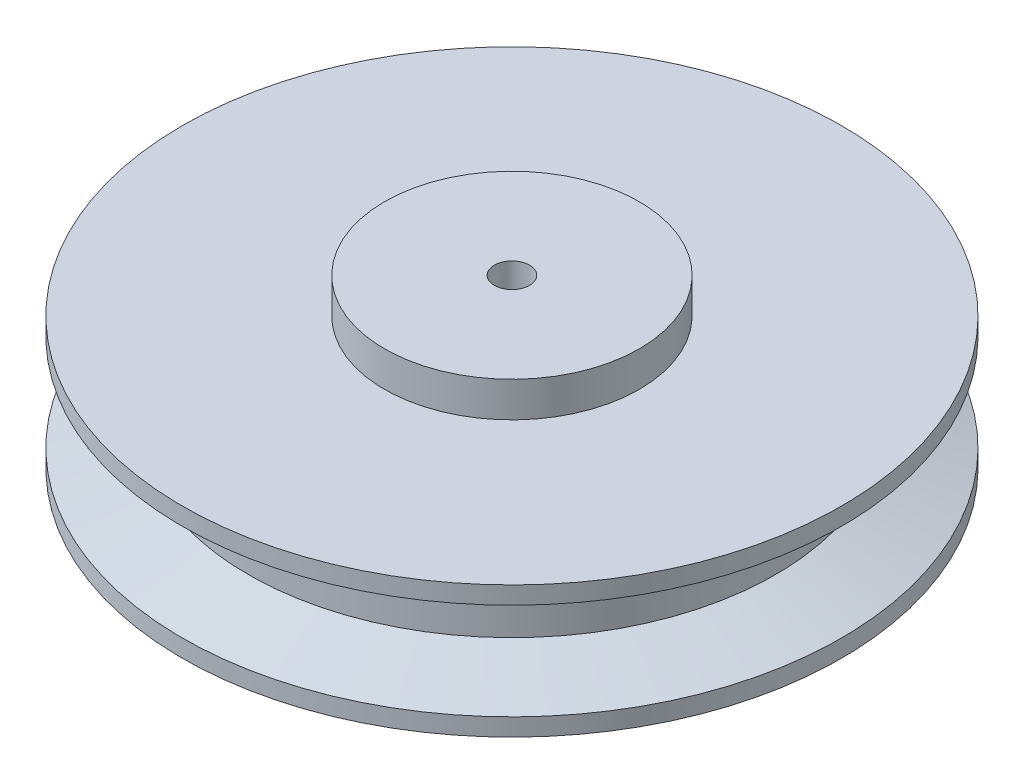
ISO-10303-21;
HEADER;
FILE_DESCRIPTION(('STEP AP214'),'2;1');
FILE_NAME('part.step','',(''),(''),'','','');
FILE_SCHEMA(('AUTOMOTIVE_DESIGN { 1 0 10303 214 1 1 1 1 }'));
ENDSEC;
DATA;
#1=APPLICATION_CONTEXT('core data for automotive mechanical design processes');
#2=APPLICATION_PROTOCOL_DEFINITION('international standard','automotive_design',2000,#1);
#3=PRODUCT_CONTEXT('',#1,'mechanical');
#4=PRODUCT('Part','Part','',(#3));
#5=PRODUCT_RELATED_PRODUCT_CATEGORY('part','',(#4));
#6=PRODUCT_DEFINITION_FORMATION('','',#4);
#7=PRODUCT_DEFINITION_CONTEXT('part definition',#1,'design');
#8=PRODUCT_DEFINITION('design','',#6,#7);
#9=PRODUCT_DEFINITION_SHAPE('','',#8);
#10=(LENGTH_UNIT() NAMED_UNIT(*) SI_UNIT(.MILLI.,.METRE.));
#11=(NAMED_UNIT(*) PLANE_ANGLE_UNIT() SI_UNIT($,.RADIAN.));
#12=(NAMED_UNIT(*) SI_UNIT($,.STERADIAN.) SOLID_ANGLE_UNIT());
#13=UNCERTAINTY_MEASURE_WITH_UNIT(LENGTH_MEASURE(1.E-05),#10,'distance_accuracy_value','');
#14=(GEOMETRIC_REPRESENTATION_CONTEXT(3) GLOBAL_UNCERTAINTY_ASSIGNED_CONTEXT((#13)) GLOBAL_UNIT_ASSIGNED_CONTEXT((#10,
#11,#12)) REPRESENTATION_CONTEXT('',''));
#15=CARTESIAN_POINT('',(0.,0.,0.));
#16=DIRECTION('',(0.,0.,1.));
#17=DIRECTION('',(1.,0.,0.));
#18=AXIS2_PLACEMENT_3D('',#15,#16,#17);
#19=CARTESIAN_POINT('',(4.,8.38418969827537,0.));
#20=DIRECTION('',(0.,-1.,0.));
#21=DIRECTION('',(1.,0.,0.));
#22=AXIS2_PLACEMENT_3D('',#19,#20,#21);
#23=PLANE('',#22);
#24=CARTESIAN_POINT('',(0.,8.38418969827537,0.));
#25=DIRECTION('',(0.,1.,0.));
#26=DIRECTION('',(-1.,0.,0.));
#27=AXIS2_PLACEMENT_3D('',#24,#25,#26);
#28=CIRCLE('',#27,4.);
#29=CARTESIAN_POINT('',(-4.,8.38418969827537,0.));
#30=VERTEX_POINT('',#29);
#31=EDGE_CURVE('E10',#30,#30,#28,.T.);
#32=ORIENTED_EDGE('',*,*,#31,.F.);
#33=EDGE_LOOP('',(#32));
#34=FACE_BOUND('',#33,.T.);
#35=CARTESIAN_POINT('',(0.,8.38418969827537,0.));
#36=DIRECTION('',(0.,1.,0.));
#37=DIRECTION('',(-1.,0.,0.));
#38=AXIS2_PLACEMENT_3D('',#35,#36,#37);
#39=CIRCLE('',#38,29.);
#40=CARTESIAN_POINT('',(-29.,8.38418969827537,0.));
#41=VERTEX_POINT('',#40);
#42=EDGE_CURVE('E45',#41,#41,#39,.T.);
#43=ORIENTED_EDGE('',*,*,#42,.T.);
#44=EDGE_LOOP('',(#43));
#45=FACE_BOUND('',#44,.T.);
#46=ADVANCED_FACE('F39',(#34,#45),#23,.F.);
#47=CARTESIAN_POINT('',(0.,0.,0.));
#48=DIRECTION('',(0.,1.,0.));
#49=DIRECTION('',(-1.,0.,0.));
#50=AXIS2_PLACEMENT_3D('',#47,#48,#49);
#51=CYLINDRICAL_SURFACE('',#50,29.);
#52=ORIENTED_EDGE('',*,*,#42,.F.);
#53=EDGE_LOOP('',(#52));
#54=FACE_BOUND('',#53,.T.);
#55=CARTESIAN_POINT('',(0.,0.384189698275366,0.));
#56=DIRECTION('',(0.,1.,0.));
#57=DIRECTION('',(-1.,0.,0.));
#58=AXIS2_PLACEMENT_3D('',#55,#56,#57);
#59=CIRCLE('',#58,29.);
#60=CARTESIAN_POINT('',(-29.,0.384189698275363,0.));
#61=VERTEX_POINT('',#60);
#62=EDGE_CURVE('E49',#61,#61,#59,.T.);
#63=ORIENTED_EDGE('',*,*,#62,.T.);
#64=EDGE_LOOP('',(#63));
#65=FACE_BOUND('',#64,.T.);
#66=ADVANCED_FACE('F89',(#54,#65),#51,.T.);
#67=CARTESIAN_POINT('',(29.,0.384189698275366,0.));
#68=DIRECTION('',(0.,-1.,0.));
#69=DIRECTION('',(1.,0.,0.));
#70=AXIS2_PLACEMENT_3D('',#67,#68,#69);
#71=PLANE('',#70);
#72=ORIENTED_EDGE('',*,*,#62,.F.);
#73=EDGE_LOOP('',(#72));
#74=FACE_BOUND('',#73,.T.);
#75=CARTESIAN_POINT('',(0.,0.384189698275362,0.));
#76=DIRECTION('',(0.,1.,0.));
#77=DIRECTION('',(-1.,0.,0.));
#78=AXIS2_PLACEMENT_3D('',#75,#76,#77);
#79=CIRCLE('',#78,75.);
#80=CARTESIAN_POINT('',(-75.,0.384189698275355,0.));
#81=VERTEX_POINT('',#80);
#82=EDGE_CURVE('E53',#81,#81,#79,.T.);
#83=ORIENTED_EDGE('',*,*,#82,.T.);
#84=EDGE_LOOP('',(#83));
#85=FACE_BOUND('',#84,.T.);
#86=ADVANCED_FACE('F94',(#74,#85),#71,.F.);
#87=CARTESIAN_POINT('',(0.,0.,0.));
#88=DIRECTION('',(0.,1.,0.));
#89=DIRECTION('',(-1.,0.,0.));
#90=AXIS2_PLACEMENT_3D('',#87,#88,#89);
#91=CYLINDRICAL_SURFACE('',#90,75.);
#92=ORIENTED_EDGE('',*,*,#82,.F.);
#93=EDGE_LOOP('',(#92));
#94=FACE_BOUND('',#93,.T.);
#95=CARTESIAN_POINT('',(0.,-3.61581030172464,0.));
#96=DIRECTION('',(0.,1.,0.));
#97=DIRECTION('',(-1.,0.,0.));
#98=AXIS2_PLACEMENT_3D('',#95,#96,#97);
#99=CIRCLE('',#98,75.);
#100=CARTESIAN_POINT('',(-75.,-3.61581030172465,0.));
#101=VERTEX_POINT('',#100);
#102=EDGE_CURVE('E58',#101,#101,#99,.T.);
#103=ORIENTED_EDGE('',*,*,#102,.T.);
#104=EDGE_LOOP('',(#103));
#105=FACE_BOUND('',#104,.T.);
#106=ADVANCED_FACE('F99',(#94,#105),#91,.T.);
#107=CARTESIAN_POINT('',(0.,-8.61581030172464,0.));
#108=DIRECTION('',(0.,1.,0.));
#109=DIRECTION('',(-1.,0.,0.));
#110=AXIS2_PLACEMENT_3D('',#107,#108,#109);
#111=CONICAL_SURFACE('',#110,60.,1.24904577239825);
#112=ORIENTED_EDGE('',*,*,#102,.F.);
#113=EDGE_LOOP('',(#112));
#114=FACE_BOUND('',#113,.T.);
#115=CARTESIAN_POINT('',(0.,-8.61581030172464,0.));
#116=DIRECTION('',(0.,1.,0.));
#117=DIRECTION('',(-1.,0.,0.));
#118=AXIS2_PLACEMENT_3D('',#115,#116,#117);
#119=CIRCLE('',#118,60.);
#120=CARTESIAN_POINT('',(-60.,-8.61581030172464,0.));
#121=VERTEX_POINT('',#120);
#122=EDGE_CURVE('E61',#121,#121,#119,.T.);
#123=ORIENTED_EDGE('',*,*,#122,.T.);
#124=EDGE_LOOP('',(#123));
#125=FACE_BOUND('',#124,.T.);
#126=ADVANCED_FACE('F106',(#114,#125),#111,.T.);
#127=CARTESIAN_POINT('',(0.,0.,0.));
#128=DIRECTION('',(0.,1.,0.));
#129=DIRECTION('',(-1.,0.,0.));
#130=AXIS2_PLACEMENT_3D('',#127,#128,#129);
#131=CYLINDRICAL_SURFACE('',#130,60.);
#132=ORIENTED_EDGE('',*,*,#122,.F.);
#133=EDGE_LOOP('',(#132));
#134=FACE_BOUND('',#133,.T.);
#135=CARTESIAN_POINT('',(0.,-20.6158103017246,0.));
#136=DIRECTION('',(0.,1.,0.));
#137=DIRECTION('',(-1.,0.,0.));
#138=AXIS2_PLACEMENT_3D('',#135,#136,#137);
#139=CIRCLE('',#138,60.);
#140=CARTESIAN_POINT('',(-60.,-20.6158103017246,0.));
#141=VERTEX_POINT('',#140);
#142=EDGE_CURVE('E64',#141,#141,#139,.T.);
#143=ORIENTED_EDGE('',*,*,#142,.T.);
#144=EDGE_LOOP('',(#143));
#145=FACE_BOUND('',#144,.T.);
#146=ADVANCED_FACE('F110',(#134,#145),#131,.T.);
#147=CARTESIAN_POINT('',(0.,-25.6158103017246,0.));
#148=DIRECTION('',(0.,-1.,0.));
#149=DIRECTION('',(1.,0.,0.));
#150=AXIS2_PLACEMENT_3D('',#147,#148,#149);
#151=CONICAL_SURFACE('',#150,75.,1.24904577239825);
#152=ORIENTED_EDGE('',*,*,#142,.F.);
#153=EDGE_LOOP('',(#152));
#154=FACE_BOUND('',#153,.T.);
#155=CARTESIAN_POINT('',(0.,-25.6158103017246,0.));
#156=DIRECTION('',(0.,1.,0.));
#157=DIRECTION('',(-1.,0.,0.));
#158=AXIS2_PLACEMENT_3D('',#155,#156,#157);
#159=CIRCLE('',#158,75.);
#160=CARTESIAN_POINT('',(-75.,-25.6158103017246,0.));
#161=VERTEX_POINT('',#160);
#162=EDGE_CURVE('E67',#161,#161,#159,.T.);
#163=ORIENTED_EDGE('',*,*,#162,.T.);
#164=EDGE_LOOP('',(#163));
#165=FACE_BOUND('',#164,.T.);
#166=ADVANCED_FACE('F114',(#154,#165),#151,.T.);
#167=CARTESIAN_POINT('',(0.,0.,0.));
#168=DIRECTION('',(0.,1.,0.));
#169=DIRECTION('',(-1.,0.,0.));
#170=AXIS2_PLACEMENT_3D('',#167,#168,#169);
#171=CYLINDRICAL_SURFACE('',#170,75.);
#172=ORIENTED_EDGE('',*,*,#162,.F.);
#173=EDGE_LOOP('',(#172));
#174=FACE_BOUND('',#173,.T.);
#175=CARTESIAN_POINT('',(0.,-29.6158103017246,0.));
#176=DIRECTION('',(0.,1.,0.));
#177=DIRECTION('',(-1.,0.,0.));
#178=AXIS2_PLACEMENT_3D('',#175,#176,#177);
#179=CIRCLE('',#178,75.);
#180=CARTESIAN_POINT('',(-75.,-29.6158103017246,0.));
#181=VERTEX_POINT('',#180);
#182=EDGE_CURVE('E70',#181,#181,#179,.T.);
#183=ORIENTED_EDGE('',*,*,#182,.T.);
#184=EDGE_LOOP('',(#183));
#185=FACE_BOUND('',#184,.T.);
#186=ADVANCED_FACE('F85',(#174,#185),#171,.T.);
#187=CARTESIAN_POINT('',(75.,-29.6158103017246,0.));
#188=DIRECTION('',(0.,1.,0.));
#189=DIRECTION('',(-1.,0.,0.));
#190=AXIS2_PLACEMENT_3D('',#187,#188,#189);
#191=PLANE('',#190);
#192=ORIENTED_EDGE('',*,*,#182,.F.);
#193=EDGE_LOOP('',(#192));
#194=FACE_BOUND('',#193,.T.);
#195=CARTESIAN_POINT('',(0.,-29.6158103017246,0.));
#196=DIRECTION('',(0.,1.,0.));
#197=DIRECTION('',(-1.,0.,0.));
#198=AXIS2_PLACEMENT_3D('',#195,#196,#197);
#199=CIRCLE('',#198,4.);
#200=CARTESIAN_POINT('',(-4.,-29.6158103017246,0.));
#201=VERTEX_POINT('',#200);
#202=EDGE_CURVE('E73',#201,#201,#199,.T.);
#203=ORIENTED_EDGE('',*,*,#202,.T.);
#204=EDGE_LOOP('',(#203));
#205=FACE_BOUND('',#204,.T.);
#206=ADVANCED_FACE('F77',(#194,#205),#191,.F.);
#207=CARTESIAN_POINT('',(0.,0.,0.));
#208=DIRECTION('',(0.,1.,0.));
#209=DIRECTION('',(-1.,0.,0.));
#210=AXIS2_PLACEMENT_3D('',#207,#208,#209);
#211=CYLINDRICAL_SURFACE('',#210,4.);
#212=ORIENTED_EDGE('',*,*,#202,.F.);
#213=EDGE_LOOP('',(#212));
#214=FACE_BOUND('',#213,.T.);
#215=ORIENTED_EDGE('',*,*,#31,.T.);
#216=EDGE_LOOP('',(#215));
#217=FACE_BOUND('',#216,.T.);
#218=ADVANCED_FACE('F79',(#214,#217),#211,.F.);
#219=CLOSED_SHELL('',(#46,#66,#86,#106,#126,#146,#166,#186,#206,#218));
#220=MANIFOLD_SOLID_BREP('B2',#219);
#221=ADVANCED_BREP_SHAPE_REPRESENTATION('',(#18,#220),#14);
#222=SHAPE_DEFINITION_REPRESENTATION(#9,#221);
ENDSEC;
END-ISO-10303-21;
